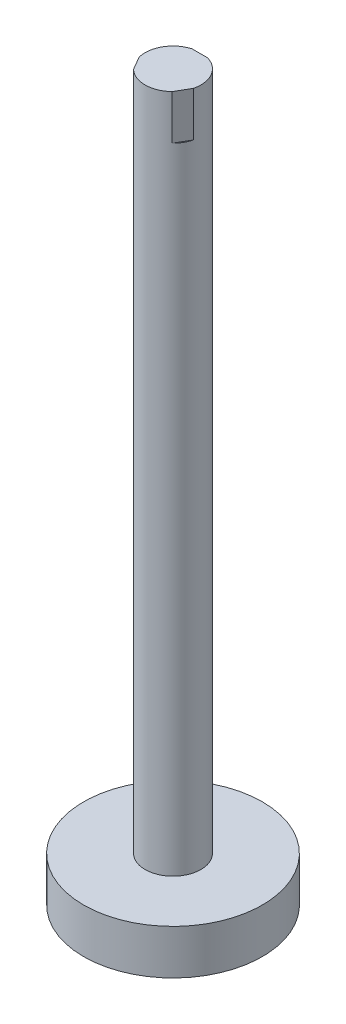
ISO-10303-21;
HEADER;
FILE_DESCRIPTION(('STEP AP214'),'2;1');
FILE_NAME('part.step','',(''),(''),'','','');
FILE_SCHEMA(('AUTOMOTIVE_DESIGN { 1 0 10303 214 1 1 1 1 }'));
ENDSEC;
DATA;
#1=APPLICATION_CONTEXT('core data for automotive mechanical design processes');
#2=APPLICATION_PROTOCOL_DEFINITION('international standard','automotive_design',2000,#1);
#3=PRODUCT_CONTEXT('',#1,'mechanical');
#4=PRODUCT('Part','Part','',(#3));
#5=PRODUCT_RELATED_PRODUCT_CATEGORY('part','',(#4));
#6=PRODUCT_DEFINITION_FORMATION('','',#4);
#7=PRODUCT_DEFINITION_CONTEXT('part definition',#1,'design');
#8=PRODUCT_DEFINITION('design','',#6,#7);
#9=PRODUCT_DEFINITION_SHAPE('','',#8);
#10=(LENGTH_UNIT() NAMED_UNIT(*) SI_UNIT(.MILLI.,.METRE.));
#11=(NAMED_UNIT(*) PLANE_ANGLE_UNIT() SI_UNIT($,.RADIAN.));
#12=(NAMED_UNIT(*) SI_UNIT($,.STERADIAN.) SOLID_ANGLE_UNIT());
#13=UNCERTAINTY_MEASURE_WITH_UNIT(LENGTH_MEASURE(1.E-05),#10,'distance_accuracy_value','');
#14=(GEOMETRIC_REPRESENTATION_CONTEXT(3) GLOBAL_UNCERTAINTY_ASSIGNED_CONTEXT((#13)) GLOBAL_UNIT_ASSIGNED_CONTEXT((#10,
#11,#12)) REPRESENTATION_CONTEXT('',''));
#15=CARTESIAN_POINT('',(0.,0.,0.));
#16=DIRECTION('',(0.,0.,1.));
#17=DIRECTION('',(1.,0.,0.));
#18=AXIS2_PLACEMENT_3D('',#15,#16,#17);
#19=CARTESIAN_POINT('',(0.,-10.,0.));
#20=DIRECTION('',(0.,1.,0.));
#21=DIRECTION('',(0.,0.,1.));
#22=AXIS2_PLACEMENT_3D('',#19,#20,#21);
#23=CYLINDRICAL_SURFACE('',#22,20.);
#24=CARTESIAN_POINT('',(0.,-10.,0.));
#25=DIRECTION('',(0.,1.,0.));
#26=DIRECTION('',(0.,0.,1.));
#27=AXIS2_PLACEMENT_3D('',#24,#25,#26);
#28=CIRCLE('',#27,20.);
#29=CARTESIAN_POINT('',(0.,-10.,20.));
#30=VERTEX_POINT('',#29);
#31=EDGE_CURVE('E48',#30,#30,#28,.T.);
#32=ORIENTED_EDGE('',*,*,#31,.T.);
#33=EDGE_LOOP('',(#32));
#34=FACE_BOUND('',#33,.T.);
#35=CARTESIAN_POINT('',(0.,0.,0.));
#36=DIRECTION('',(0.,1.,0.));
#37=DIRECTION('',(0.,0.,1.));
#38=AXIS2_PLACEMENT_3D('',#35,#36,#37);
#39=CIRCLE('',#38,20.);
#40=CARTESIAN_POINT('',(0.,0.,20.));
#41=VERTEX_POINT('',#40);
#42=EDGE_CURVE('E43',#41,#41,#39,.T.);
#43=ORIENTED_EDGE('',*,*,#42,.F.);
#44=EDGE_LOOP('',(#43));
#45=FACE_BOUND('',#44,.T.);
#46=ADVANCED_FACE('F40',(#34,#45),#23,.T.);
#47=CARTESIAN_POINT('',(0.,-10.,0.));
#48=DIRECTION('',(0.,1.,0.));
#49=DIRECTION('',(0.,0.,1.));
#50=AXIS2_PLACEMENT_3D('',#47,#48,#49);
#51=PLANE('',#50);
#52=CARTESIAN_POINT('',(0.,-10.,0.));
#53=DIRECTION('',(0.,-1.,0.));
#54=DIRECTION('',(0.,0.,-1.));
#55=AXIS2_PLACEMENT_3D('',#52,#53,#54);
#56=CIRCLE('',#55,8.);
#57=CARTESIAN_POINT('',(0.,-10.,-8.));
#58=VERTEX_POINT('',#57);
#59=EDGE_CURVE('E203',#58,#58,#56,.T.);
#60=ORIENTED_EDGE('',*,*,#59,.F.);
#61=EDGE_LOOP('',(#60));
#62=FACE_BOUND('',#61,.T.);
#63=ORIENTED_EDGE('',*,*,#31,.F.);
#64=EDGE_LOOP('',(#63));
#65=FACE_BOUND('',#64,.T.);
#66=ADVANCED_FACE('F154',(#62,#65),#51,.F.);
#67=CARTESIAN_POINT('',(0.,0.,0.));
#68=DIRECTION('',(0.,1.,0.));
#69=DIRECTION('',(0.,0.,1.));
#70=AXIS2_PLACEMENT_3D('',#67,#68,#69);
#71=PLANE('',#70);
#72=CARTESIAN_POINT('',(0.,0.,0.));
#73=DIRECTION('',(0.,1.,0.));
#74=DIRECTION('',(0.,0.,1.));
#75=AXIS2_PLACEMENT_3D('',#72,#73,#74);
#76=CIRCLE('',#75,6.25);
#77=CARTESIAN_POINT('',(0.,0.,6.25));
#78=VERTEX_POINT('',#77);
#79=EDGE_CURVE('E11',#78,#78,#76,.T.);
#80=ORIENTED_EDGE('',*,*,#79,.F.);
#81=EDGE_LOOP('',(#80));
#82=FACE_BOUND('',#81,.T.);
#83=ORIENTED_EDGE('',*,*,#42,.T.);
#84=EDGE_LOOP('',(#83));
#85=FACE_BOUND('',#84,.T.);
#86=ADVANCED_FACE('F151',(#82,#85),#71,.T.);
#87=CARTESIAN_POINT('',(0.,152.,0.));
#88=DIRECTION('',(0.,-1.,0.));
#89=DIRECTION('',(0.,0.,-1.));
#90=AXIS2_PLACEMENT_3D('',#87,#88,#89);
#91=CYLINDRICAL_SURFACE('',#90,6.25);
#92=CARTESIAN_POINT('',(0.,152.,0.));
#93=DIRECTION('',(0.,1.,0.));
#94=DIRECTION('',(0.,0.,1.));
#95=AXIS2_PLACEMENT_3D('',#92,#93,#94);
#96=CIRCLE('',#95,6.25);
#97=CARTESIAN_POINT('',(-4.32115242270661,152.,4.51554445662279));
#98=VERTEX_POINT('',#97);
#99=CARTESIAN_POINT('',(4.32115242270667,152.,4.51554445662273));
#100=VERTEX_POINT('',#99);
#101=EDGE_CURVE('E144',#98,#100,#96,.T.);
#102=ORIENTED_EDGE('',*,*,#101,.F.);
#103=DIRECTION('',(0.,1.,0.));
#104=VECTOR('',#103,1.);
#105=CARTESIAN_POINT('',(-4.32115242270661,142.,4.51554445662279));
#106=LINE('',#105,#104);
#107=CARTESIAN_POINT('',(-4.32115242270661,142.,4.51554445662279));
#108=VERTEX_POINT('',#107);
#109=EDGE_CURVE('E64',#108,#98,#106,.T.);
#110=ORIENTED_EDGE('',*,*,#109,.F.);
#111=CARTESIAN_POINT('',(0.,142.,0.));
#112=DIRECTION('',(0.,1.,0.));
#113=DIRECTION('',(0.866025403784436,0.,-0.500000000000004));
#114=AXIS2_PLACEMENT_3D('',#111,#112,#113);
#115=CIRCLE('',#114,6.25);
#116=CARTESIAN_POINT('',(-6.07115242270663,142.,1.48445554337726));
#117=VERTEX_POINT('',#116);
#118=EDGE_CURVE('E102',#117,#108,#115,.T.);
#119=ORIENTED_EDGE('',*,*,#118,.F.);
#120=DIRECTION('',(0.,1.,0.));
#121=VECTOR('',#120,1.);
#122=CARTESIAN_POINT('',(-6.07115242270663,142.,1.48445554337726));
#123=LINE('',#122,#121);
#124=CARTESIAN_POINT('',(-6.07115242270663,152.,1.48445554337726));
#125=VERTEX_POINT('',#124);
#126=EDGE_CURVE('E92',#117,#125,#123,.T.);
#127=ORIENTED_EDGE('',*,*,#126,.T.);
#128=CARTESIAN_POINT('',(-1.75,152.,-6.));
#129=VERTEX_POINT('',#128);
#130=EDGE_CURVE('E143',#129,#125,#96,.T.);
#131=ORIENTED_EDGE('',*,*,#130,.F.);
#132=DIRECTION('',(0.,1.,0.));
#133=VECTOR('',#132,1.);
#134=CARTESIAN_POINT('',(-1.75,142.,-6.));
#135=LINE('',#134,#133);
#136=CARTESIAN_POINT('',(-1.75,142.,-6.));
#137=VERTEX_POINT('',#136);
#138=EDGE_CURVE('E138',#137,#129,#135,.T.);
#139=ORIENTED_EDGE('',*,*,#138,.F.);
#140=CARTESIAN_POINT('',(0.,142.,0.));
#141=DIRECTION('',(0.,1.,0.));
#142=DIRECTION('',(0.,0.,1.));
#143=AXIS2_PLACEMENT_3D('',#140,#141,#142);
#144=CIRCLE('',#143,6.25);
#145=CARTESIAN_POINT('',(1.75,142.,-6.));
#146=VERTEX_POINT('',#145);
#147=EDGE_CURVE('E132',#146,#137,#144,.T.);
#148=ORIENTED_EDGE('',*,*,#147,.F.);
#149=DIRECTION('',(0.,1.,0.));
#150=VECTOR('',#149,1.);
#151=CARTESIAN_POINT('',(1.75,142.,-6.));
#152=LINE('',#151,#150);
#153=CARTESIAN_POINT('',(1.75,152.,-6.));
#154=VERTEX_POINT('',#153);
#155=EDGE_CURVE('E135',#146,#154,#152,.T.);
#156=ORIENTED_EDGE('',*,*,#155,.T.);
#157=CARTESIAN_POINT('',(6.07115242270665,152.,1.48445554337718));
#158=VERTEX_POINT('',#157);
#159=EDGE_CURVE('E140',#158,#154,#96,.T.);
#160=ORIENTED_EDGE('',*,*,#159,.F.);
#161=DIRECTION('',(0.,1.,0.));
#162=VECTOR('',#161,1.);
#163=CARTESIAN_POINT('',(6.07115242270665,142.,1.48445554337718));
#164=LINE('',#163,#162);
#165=CARTESIAN_POINT('',(6.07115242270665,142.,1.48445554337718));
#166=VERTEX_POINT('',#165);
#167=EDGE_CURVE('E56',#166,#158,#164,.T.);
#168=ORIENTED_EDGE('',*,*,#167,.F.);
#169=CARTESIAN_POINT('',(0.,142.,0.));
#170=DIRECTION('',(0.,1.,0.));
#171=DIRECTION('',(-0.866025403784443,0.,-0.499999999999992));
#172=AXIS2_PLACEMENT_3D('',#169,#170,#171);
#173=CIRCLE('',#172,6.25);
#174=CARTESIAN_POINT('',(4.32115242270667,142.,4.51554445662273));
#175=VERTEX_POINT('',#174);
#176=EDGE_CURVE('E119',#175,#166,#173,.T.);
#177=ORIENTED_EDGE('',*,*,#176,.F.);
#178=DIRECTION('',(0.,1.,0.));
#179=VECTOR('',#178,1.);
#180=CARTESIAN_POINT('',(4.32115242270667,142.,4.51554445662273));
#181=LINE('',#180,#179);
#182=EDGE_CURVE('E123',#175,#100,#181,.T.);
#183=ORIENTED_EDGE('',*,*,#182,.T.);
#184=EDGE_LOOP('',(#102,#110,#119,#127,#131,#139,#148,#156,#160,#168,#177,#183));
#185=FACE_BOUND('',#184,.T.);
#186=ORIENTED_EDGE('',*,*,#79,.T.);
#187=EDGE_LOOP('',(#186));
#188=FACE_BOUND('',#187,.T.);
#189=ADVANCED_FACE('F108',(#185,#188),#91,.T.);
#190=CARTESIAN_POINT('',(0.,152.,0.));
#191=DIRECTION('',(0.,1.,0.));
#192=DIRECTION('',(0.,0.,1.));
#193=AXIS2_PLACEMENT_3D('',#190,#191,#192);
#194=PLANE('',#193);
#195=DIRECTION('',(-0.500000000000004,0.,-0.866025403784436));
#196=VECTOR('',#195,1.);
#197=CARTESIAN_POINT('',(-4.32115242270661,152.,4.51554445662279));
#198=LINE('',#197,#196);
#199=EDGE_CURVE('E97',#98,#125,#198,.T.);
#200=ORIENTED_EDGE('',*,*,#199,.F.);
#201=ORIENTED_EDGE('',*,*,#101,.T.);
#202=DIRECTION('',(-0.499999999999992,0.,0.866025403784443));
#203=VECTOR('',#202,1.);
#204=CARTESIAN_POINT('',(6.07115242270665,152.,1.48445554337718));
#205=LINE('',#204,#203);
#206=EDGE_CURVE('E120',#158,#100,#205,.T.);
#207=ORIENTED_EDGE('',*,*,#206,.F.);
#208=ORIENTED_EDGE('',*,*,#159,.T.);
#209=DIRECTION('',(1.,0.,0.));
#210=VECTOR('',#209,1.);
#211=CARTESIAN_POINT('',(-1.75,152.,-6.));
#212=LINE('',#211,#210);
#213=EDGE_CURVE('E114',#129,#154,#212,.T.);
#214=ORIENTED_EDGE('',*,*,#213,.F.);
#215=ORIENTED_EDGE('',*,*,#130,.T.);
#216=EDGE_LOOP('',(#200,#201,#207,#208,#214,#215));
#217=FACE_BOUND('',#216,.T.);
#218=ADVANCED_FACE('F171',(#217),#194,.T.);
#219=CARTESIAN_POINT('',(-1.75,142.,-6.));
#220=DIRECTION('',(0.,0.,1.));
#221=DIRECTION('',(1.,0.,0.));
#222=AXIS2_PLACEMENT_3D('',#219,#220,#221);
#223=PLANE('',#222);
#224=ORIENTED_EDGE('',*,*,#213,.T.);
#225=ORIENTED_EDGE('',*,*,#155,.F.);
#226=DIRECTION('',(1.,0.,0.));
#227=VECTOR('',#226,1.);
#228=CARTESIAN_POINT('',(-1.75,142.,-6.));
#229=LINE('',#228,#227);
#230=EDGE_CURVE('E129',#137,#146,#229,.T.);
#231=ORIENTED_EDGE('',*,*,#230,.F.);
#232=ORIENTED_EDGE('',*,*,#138,.T.);
#233=EDGE_LOOP('',(#224,#225,#231,#232));
#234=FACE_BOUND('',#233,.T.);
#235=ADVANCED_FACE('F174',(#234),#223,.F.);
#236=CARTESIAN_POINT('',(0.,142.,0.));
#237=DIRECTION('',(0.,1.,0.));
#238=DIRECTION('',(0.,0.,1.));
#239=AXIS2_PLACEMENT_3D('',#236,#237,#238);
#240=PLANE('',#239);
#241=ORIENTED_EDGE('',*,*,#230,.T.);
#242=ORIENTED_EDGE('',*,*,#147,.T.);
#243=EDGE_LOOP('',(#241,#242));
#244=FACE_BOUND('',#243,.T.);
#245=ADVANCED_FACE('F178',(#244),#240,.T.);
#246=CARTESIAN_POINT('',(6.07115242270665,142.,1.48445554337718));
#247=DIRECTION('',(-0.866025403784443,0.,-0.499999999999992));
#248=DIRECTION('',(-0.499999999999992,0.,0.866025403784443));
#249=AXIS2_PLACEMENT_3D('',#246,#247,#248);
#250=PLANE('',#249);
#251=ORIENTED_EDGE('',*,*,#206,.T.);
#252=ORIENTED_EDGE('',*,*,#182,.F.);
#253=DIRECTION('',(-0.499999999999992,0.,0.866025403784443));
#254=VECTOR('',#253,1.);
#255=CARTESIAN_POINT('',(6.07115242270665,142.,1.48445554337718));
#256=LINE('',#255,#254);
#257=EDGE_CURVE('E116',#166,#175,#256,.T.);
#258=ORIENTED_EDGE('',*,*,#257,.F.);
#259=ORIENTED_EDGE('',*,*,#167,.T.);
#260=EDGE_LOOP('',(#251,#252,#258,#259));
#261=FACE_BOUND('',#260,.T.);
#262=ADVANCED_FACE('F182',(#261),#250,.F.);
#263=CARTESIAN_POINT('',(0.,142.,0.));
#264=DIRECTION('',(0.,1.,0.));
#265=DIRECTION('',(-0.866025403784443,0.,-0.499999999999992));
#266=AXIS2_PLACEMENT_3D('',#263,#264,#265);
#267=PLANE('',#266);
#268=ORIENTED_EDGE('',*,*,#257,.T.);
#269=ORIENTED_EDGE('',*,*,#176,.T.);
#270=EDGE_LOOP('',(#268,#269));
#271=FACE_BOUND('',#270,.T.);
#272=ADVANCED_FACE('F186',(#271),#267,.T.);
#273=CARTESIAN_POINT('',(-4.32115242270661,142.,4.51554445662279));
#274=DIRECTION('',(0.866025403784436,0.,-0.500000000000004));
#275=DIRECTION('',(-0.500000000000004,0.,-0.866025403784436));
#276=AXIS2_PLACEMENT_3D('',#273,#274,#275);
#277=PLANE('',#276);
#278=ORIENTED_EDGE('',*,*,#199,.T.);
#279=ORIENTED_EDGE('',*,*,#126,.F.);
#280=DIRECTION('',(-0.500000000000004,0.,-0.866025403784436));
#281=VECTOR('',#280,1.);
#282=CARTESIAN_POINT('',(-4.32115242270661,142.,4.51554445662279));
#283=LINE('',#282,#281);
#284=EDGE_CURVE('E95',#108,#117,#283,.T.);
#285=ORIENTED_EDGE('',*,*,#284,.F.);
#286=ORIENTED_EDGE('',*,*,#109,.T.);
#287=EDGE_LOOP('',(#278,#279,#285,#286));
#288=FACE_BOUND('',#287,.T.);
#289=ADVANCED_FACE('F94',(#288),#277,.F.);
#290=CARTESIAN_POINT('',(0.,142.,0.));
#291=DIRECTION('',(0.,1.,0.));
#292=DIRECTION('',(0.866025403784436,0.,-0.500000000000004));
#293=AXIS2_PLACEMENT_3D('',#290,#291,#292);
#294=PLANE('',#293);
#295=ORIENTED_EDGE('',*,*,#284,.T.);
#296=ORIENTED_EDGE('',*,*,#118,.T.);
#297=EDGE_LOOP('',(#295,#296));
#298=FACE_BOUND('',#297,.T.);
#299=ADVANCED_FACE('F105',(#298),#294,.T.);
#300=CARTESIAN_POINT('',(0.,-9.,0.));
#301=DIRECTION('',(0.,-1.,0.));
#302=DIRECTION('',(0.,0.,-1.));
#303=AXIS2_PLACEMENT_3D('',#300,#301,#302);
#304=CYLINDRICAL_SURFACE('',#303,8.);
#305=CARTESIAN_POINT('',(0.,-9.,0.));
#306=DIRECTION('',(0.,-1.,0.));
#307=DIRECTION('',(0.,0.,-1.));
#308=AXIS2_PLACEMENT_3D('',#305,#306,#307);
#309=CIRCLE('',#308,8.);
#310=CARTESIAN_POINT('',(0.,-9.,-8.));
#311=VERTEX_POINT('',#310);
#312=EDGE_CURVE('E125',#311,#311,#309,.T.);
#313=ORIENTED_EDGE('',*,*,#312,.F.);
#314=EDGE_LOOP('',(#313));
#315=FACE_BOUND('',#314,.T.);
#316=ORIENTED_EDGE('',*,*,#59,.T.);
#317=EDGE_LOOP('',(#316));
#318=FACE_BOUND('',#317,.T.);
#319=ADVANCED_FACE('F193',(#315,#318),#304,.F.);
#320=CARTESIAN_POINT('',(0.,-9.,0.));
#321=DIRECTION('',(0.,-1.,0.));
#322=DIRECTION('',(0.,0.,-1.));
#323=AXIS2_PLACEMENT_3D('',#320,#321,#322);
#324=PLANE('',#323);
#325=ORIENTED_EDGE('',*,*,#312,.T.);
#326=EDGE_LOOP('',(#325));
#327=FACE_BOUND('',#326,.T.);
#328=ADVANCED_FACE('F195',(#327),#324,.T.);
#329=CLOSED_SHELL('',(#46,#66,#86,#189,#218,#235,#245,#262,#272,#289,#299,#319,#328));
#330=MANIFOLD_SOLID_BREP('B2',#329);
#331=ADVANCED_BREP_SHAPE_REPRESENTATION('',(#18,#330),#14);
#332=SHAPE_DEFINITION_REPRESENTATION(#9,#331);
ENDSEC;
END-ISO-10303-21;
